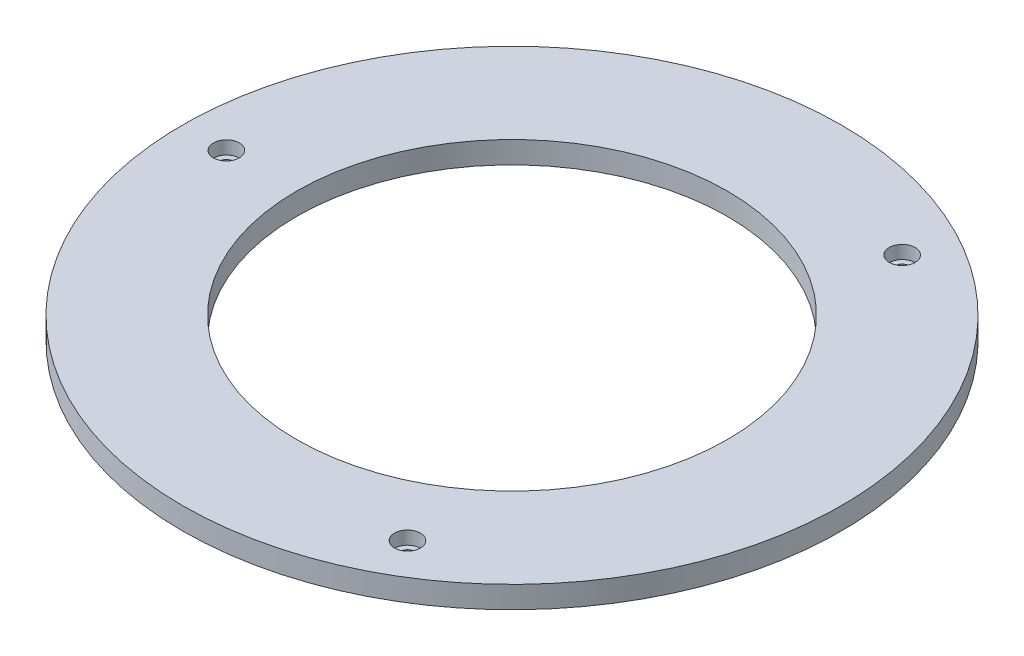
ISO-10303-21;
HEADER;
FILE_DESCRIPTION(('STEP AP214'),'2;1');
FILE_NAME('part.step','',(''),(''),'','','');
FILE_SCHEMA(('AUTOMOTIVE_DESIGN { 1 0 10303 214 1 1 1 1 }'));
ENDSEC;
DATA;
#1=APPLICATION_CONTEXT('core data for automotive mechanical design processes');
#2=APPLICATION_PROTOCOL_DEFINITION('international standard','automotive_design',2000,#1);
#3=PRODUCT_CONTEXT('',#1,'mechanical');
#4=PRODUCT('Part','Part','',(#3));
#5=PRODUCT_RELATED_PRODUCT_CATEGORY('part','',(#4));
#6=PRODUCT_DEFINITION_FORMATION('','',#4);
#7=PRODUCT_DEFINITION_CONTEXT('part definition',#1,'design');
#8=PRODUCT_DEFINITION('design','',#6,#7);
#9=PRODUCT_DEFINITION_SHAPE('','',#8);
#10=(LENGTH_UNIT() NAMED_UNIT(*) SI_UNIT(.MILLI.,.METRE.));
#11=(NAMED_UNIT(*) PLANE_ANGLE_UNIT() SI_UNIT($,.RADIAN.));
#12=(NAMED_UNIT(*) SI_UNIT($,.STERADIAN.) SOLID_ANGLE_UNIT());
#13=UNCERTAINTY_MEASURE_WITH_UNIT(LENGTH_MEASURE(1.E-05),#10,'distance_accuracy_value','');
#14=(GEOMETRIC_REPRESENTATION_CONTEXT(3) GLOBAL_UNCERTAINTY_ASSIGNED_CONTEXT((#13)) GLOBAL_UNIT_ASSIGNED_CONTEXT((#10,
#11,#12)) REPRESENTATION_CONTEXT('',''));
#15=CARTESIAN_POINT('',(0.,0.,0.));
#16=DIRECTION('',(0.,0.,1.));
#17=DIRECTION('',(1.,0.,0.));
#18=AXIS2_PLACEMENT_3D('',#15,#16,#17);
#19=CARTESIAN_POINT('',(32.4999999999996,1.27675647831893E-12,-56.2916512459888));
#20=DIRECTION('',(0.,1.,0.));
#21=DIRECTION('',(0.,0.,1.00000000000001));
#22=AXIS2_PLACEMENT_3D('',#19,#20,#21);
#23=CYLINDRICAL_SURFACE('',#22,1.7);
#24=CARTESIAN_POINT('',(32.4999999999996,1.27675647831893E-12,-56.2916512459888));
#25=DIRECTION('',(0.,1.,0.));
#26=DIRECTION('',(-0.866025403784452,0.,-0.499999999999997));
#27=AXIS2_PLACEMENT_3D('',#24,#25,#26);
#28=CIRCLE('',#27,1.7);
#29=CARTESIAN_POINT('',(31.027756813566,1.27675647831893E-12,-57.1416512459888));
#30=VERTEX_POINT('',#29);
#31=EDGE_CURVE('E75',#30,#30,#28,.T.);
#32=ORIENTED_EDGE('',*,*,#31,.F.);
#33=EDGE_LOOP('',(#32));
#34=FACE_BOUND('',#33,.T.);
#35=CARTESIAN_POINT('',(32.5,2.00000000000128,-56.2916512459886));
#36=DIRECTION('',(0.,1.,0.));
#37=DIRECTION('',(0.,0.,1.00000000000001));
#38=AXIS2_PLACEMENT_3D('',#35,#36,#37);
#39=CIRCLE('',#38,1.7);
#40=CARTESIAN_POINT('',(32.5,2.00000000000128,-54.5916512459886));
#41=VERTEX_POINT('',#40);
#42=EDGE_CURVE('E42',#41,#41,#39,.F.);
#43=ORIENTED_EDGE('',*,*,#42,.F.);
#44=EDGE_LOOP('',(#43));
#45=FACE_BOUND('',#44,.T.);
#46=ADVANCED_FACE('F38',(#34,#45),#23,.F.);
#47=CARTESIAN_POINT('',(32.5000000000009,1.27675647831893E-12,56.291651245989));
#48=DIRECTION('',(0.,1.,0.));
#49=DIRECTION('',(0.,0.,1.00000000000001));
#50=AXIS2_PLACEMENT_3D('',#47,#48,#49);
#51=CYLINDRICAL_SURFACE('',#50,1.7);
#52=CARTESIAN_POINT('',(32.5000000000009,1.27675647831893E-12,56.291651245989));
#53=DIRECTION('',(0.,1.,0.));
#54=DIRECTION('',(0.866025403784446,0.,-0.50000000000001));
#55=AXIS2_PLACEMENT_3D('',#52,#53,#54);
#56=CIRCLE('',#55,1.7);
#57=CARTESIAN_POINT('',(33.9722431864345,1.27675647831893E-12,55.4416512459889));
#58=VERTEX_POINT('',#57);
#59=EDGE_CURVE('E94',#58,#58,#56,.T.);
#60=ORIENTED_EDGE('',*,*,#59,.F.);
#61=EDGE_LOOP('',(#60));
#62=FACE_BOUND('',#61,.T.);
#63=CARTESIAN_POINT('',(32.500000000001,2.00000000000128,56.291651245989));
#64=DIRECTION('',(0.,1.,0.));
#65=DIRECTION('',(0.,0.,1.00000000000001));
#66=AXIS2_PLACEMENT_3D('',#63,#64,#65);
#67=CIRCLE('',#66,1.7);
#68=CARTESIAN_POINT('',(32.500000000001,2.00000000000128,57.991651245989));
#69=VERTEX_POINT('',#68);
#70=EDGE_CURVE('E65',#69,#69,#67,.F.);
#71=ORIENTED_EDGE('',*,*,#70,.F.);
#72=EDGE_LOOP('',(#71));
#73=FACE_BOUND('',#72,.T.);
#74=ADVANCED_FACE('F137',(#62,#73),#51,.F.);
#75=CARTESIAN_POINT('',(-65.0000000000001,1.27675647831893E-12,0.));
#76=DIRECTION('',(0.,1.,0.));
#77=DIRECTION('',(0.,0.,1.00000000000001));
#78=AXIS2_PLACEMENT_3D('',#75,#76,#77);
#79=CYLINDRICAL_SURFACE('',#78,1.7);
#80=CARTESIAN_POINT('',(-65.0000000000001,1.27675647831893E-12,0.));
#81=DIRECTION('',(0.,1.,0.));
#82=DIRECTION('',(0.,0.,1.00000000000001));
#83=AXIS2_PLACEMENT_3D('',#80,#81,#82);
#84=CIRCLE('',#83,1.7);
#85=CARTESIAN_POINT('',(-65.0000000000001,1.27675647831893E-12,1.70000000000002));
#86=VERTEX_POINT('',#85);
#87=EDGE_CURVE('E63',#86,#86,#84,.T.);
#88=ORIENTED_EDGE('',*,*,#87,.F.);
#89=EDGE_LOOP('',(#88));
#90=FACE_BOUND('',#89,.T.);
#91=CARTESIAN_POINT('',(-65.0000000000001,2.00000000000128,0.));
#92=DIRECTION('',(0.,1.,0.));
#93=DIRECTION('',(0.,0.,1.00000000000001));
#94=AXIS2_PLACEMENT_3D('',#91,#92,#93);
#95=CIRCLE('',#94,1.7);
#96=CARTESIAN_POINT('',(-65.0000000000001,2.00000000000128,1.70000000000002));
#97=VERTEX_POINT('',#96);
#98=EDGE_CURVE('E60',#97,#97,#95,.F.);
#99=ORIENTED_EDGE('',*,*,#98,.F.);
#100=EDGE_LOOP('',(#99));
#101=FACE_BOUND('',#100,.T.);
#102=ADVANCED_FACE('F143',(#90,#101),#79,.F.);
#103=CARTESIAN_POINT('',(1.66533453693773E-13,5.,5.55111512312578E-13));
#104=DIRECTION('',(0.,1.,0.));
#105=DIRECTION('',(0.,0.,1.00000000000001));
#106=AXIS2_PLACEMENT_3D('',#103,#104,#105);
#107=PLANE('',#106);
#108=CARTESIAN_POINT('',(32.500000000001,5.00000000000128,56.2916512459901));
#109=DIRECTION('',(0.,1.,0.));
#110=DIRECTION('',(0.866025403784446,0.,-0.50000000000001));
#111=AXIS2_PLACEMENT_3D('',#108,#109,#110);
#112=CIRCLE('',#111,2.95);
#113=CARTESIAN_POINT('',(35.0547749411651,5.00000000000128,54.8166512459901));
#114=VERTEX_POINT('',#113);
#115=EDGE_CURVE('E77',#114,#114,#112,.T.);
#116=ORIENTED_EDGE('',*,*,#115,.F.);
#117=EDGE_LOOP('',(#116));
#118=FACE_BOUND('',#117,.T.);
#119=CARTESIAN_POINT('',(32.4999999999996,5.00000000000128,-56.2916512459888));
#120=DIRECTION('',(0.,1.,0.));
#121=DIRECTION('',(-0.866025403784452,0.,-0.499999999999997));
#122=AXIS2_PLACEMENT_3D('',#119,#120,#121);
#123=CIRCLE('',#122,2.95);
#124=CARTESIAN_POINT('',(29.9452250588355,5.00000000000128,-57.7666512459888));
#125=VERTEX_POINT('',#124);
#126=EDGE_CURVE('E90',#125,#125,#123,.T.);
#127=ORIENTED_EDGE('',*,*,#126,.F.);
#128=EDGE_LOOP('',(#127));
#129=FACE_BOUND('',#128,.T.);
#130=CARTESIAN_POINT('',(-65.,5.00000000000128,0.));
#131=DIRECTION('',(0.,1.,0.));
#132=DIRECTION('',(0.,0.,1.00000000000001));
#133=AXIS2_PLACEMENT_3D('',#130,#131,#132);
#134=CIRCLE('',#133,2.95);
#135=CARTESIAN_POINT('',(-65.,5.00000000000128,2.95000000000003));
#136=VERTEX_POINT('',#135);
#137=EDGE_CURVE('E98',#136,#136,#134,.T.);
#138=ORIENTED_EDGE('',*,*,#137,.F.);
#139=EDGE_LOOP('',(#138));
#140=FACE_BOUND('',#139,.T.);
#141=CARTESIAN_POINT('',(1.66533453693773E-13,5.,5.55111512312578E-13));
#142=DIRECTION('',(0.,1.,0.));
#143=DIRECTION('',(0.,0.,1.00000000000001));
#144=AXIS2_PLACEMENT_3D('',#141,#142,#143);
#145=CIRCLE('',#144,75.);
#146=CARTESIAN_POINT('',(1.70696790036118E-13,5.,75.0000000000013));
#147=VERTEX_POINT('',#146);
#148=EDGE_CURVE('E10',#147,#147,#145,.T.);
#149=ORIENTED_EDGE('',*,*,#148,.T.);
#150=EDGE_LOOP('',(#149));
#151=FACE_BOUND('',#150,.T.);
#152=CARTESIAN_POINT('',(1.66533453693773E-13,5.,5.55111512312578E-13));
#153=DIRECTION('',(0.,1.,0.));
#154=DIRECTION('',(0.,0.,1.00000000000001));
#155=AXIS2_PLACEMENT_3D('',#152,#153,#154);
#156=CIRCLE('',#155,49.);
#157=CARTESIAN_POINT('',(1.69253500104105E-13,5.,49.0000000000011));
#158=VERTEX_POINT('',#157);
#159=EDGE_CURVE('E54',#158,#158,#156,.T.);
#160=ORIENTED_EDGE('',*,*,#159,.F.);
#161=EDGE_LOOP('',(#160));
#162=FACE_BOUND('',#161,.T.);
#163=ADVANCED_FACE('F154',(#118,#129,#140,#151,#162),#107,.T.);
#164=CARTESIAN_POINT('',(0.,0.,0.));
#165=DIRECTION('',(0.,1.,0.));
#166=DIRECTION('',(0.,0.,1.00000000000001));
#167=AXIS2_PLACEMENT_3D('',#164,#165,#166);
#168=PLANE('',#167);
#169=ORIENTED_EDGE('',*,*,#59,.T.);
#170=EDGE_LOOP('',(#169));
#171=FACE_BOUND('',#170,.T.);
#172=ORIENTED_EDGE('',*,*,#31,.T.);
#173=EDGE_LOOP('',(#172));
#174=FACE_BOUND('',#173,.T.);
#175=ORIENTED_EDGE('',*,*,#87,.T.);
#176=EDGE_LOOP('',(#175));
#177=FACE_BOUND('',#176,.T.);
#178=CARTESIAN_POINT('',(0.,0.,0.));
#179=DIRECTION('',(0.,1.,0.));
#180=DIRECTION('',(0.,0.,1.00000000000001));
#181=AXIS2_PLACEMENT_3D('',#178,#179,#180);
#182=CIRCLE('',#181,75.);
#183=CARTESIAN_POINT('',(0.,0.,75.0000000000008));
#184=VERTEX_POINT('',#183);
#185=EDGE_CURVE('E47',#184,#184,#182,.T.);
#186=ORIENTED_EDGE('',*,*,#185,.F.);
#187=EDGE_LOOP('',(#186));
#188=FACE_BOUND('',#187,.T.);
#189=CARTESIAN_POINT('',(0.,0.,0.));
#190=DIRECTION('',(0.,1.,0.));
#191=DIRECTION('',(0.,0.,1.00000000000001));
#192=AXIS2_PLACEMENT_3D('',#189,#190,#191);
#193=CIRCLE('',#192,49.);
#194=CARTESIAN_POINT('',(0.,0.,49.0000000000005));
#195=VERTEX_POINT('',#194);
#196=EDGE_CURVE('E57',#195,#195,#193,.T.);
#197=ORIENTED_EDGE('',*,*,#196,.T.);
#198=EDGE_LOOP('',(#197));
#199=FACE_BOUND('',#198,.T.);
#200=ADVANCED_FACE('F120',(#171,#174,#177,#188,#199),#168,.F.);
#201=CARTESIAN_POINT('',(1.66533453693773E-13,5.,5.55111512312578E-13));
#202=DIRECTION('',(0.,-1.,0.));
#203=DIRECTION('',(0.,0.,-1.00000000000001));
#204=AXIS2_PLACEMENT_3D('',#201,#202,#203);
#205=CYLINDRICAL_SURFACE('',#204,75.);
#206=ORIENTED_EDGE('',*,*,#148,.F.);
#207=EDGE_LOOP('',(#206));
#208=FACE_BOUND('',#207,.T.);
#209=ORIENTED_EDGE('',*,*,#185,.T.);
#210=EDGE_LOOP('',(#209));
#211=FACE_BOUND('',#210,.T.);
#212=ADVANCED_FACE('F40',(#208,#211),#205,.T.);
#213=CARTESIAN_POINT('',(1.66533453693773E-13,5.,5.55111512312578E-13));
#214=DIRECTION('',(0.,-1.,0.));
#215=DIRECTION('',(0.,0.,-1.00000000000001));
#216=AXIS2_PLACEMENT_3D('',#213,#214,#215);
#217=CYLINDRICAL_SURFACE('',#216,49.);
#218=ORIENTED_EDGE('',*,*,#159,.T.);
#219=EDGE_LOOP('',(#218));
#220=FACE_BOUND('',#219,.T.);
#221=ORIENTED_EDGE('',*,*,#196,.F.);
#222=EDGE_LOOP('',(#221));
#223=FACE_BOUND('',#222,.T.);
#224=ADVANCED_FACE('F122',(#220,#223),#217,.F.);
#225=CARTESIAN_POINT('',(-65.0000000000001,2.00000000000128,0.));
#226=DIRECTION('',(0.,1.,0.));
#227=DIRECTION('',(0.,0.,1.00000000000001));
#228=AXIS2_PLACEMENT_3D('',#225,#226,#227);
#229=PLANE('',#228);
#230=CARTESIAN_POINT('',(-65.0000000000001,2.00000000000128,0.));
#231=DIRECTION('',(0.,1.,0.));
#232=DIRECTION('',(0.,0.,1.00000000000001));
#233=AXIS2_PLACEMENT_3D('',#230,#231,#232);
#234=CIRCLE('',#233,2.95);
#235=CARTESIAN_POINT('',(-65.0000000000001,2.00000000000128,2.95000000000003));
#236=VERTEX_POINT('',#235);
#237=EDGE_CURVE('E64',#236,#236,#234,.T.);
#238=ORIENTED_EDGE('',*,*,#237,.T.);
#239=EDGE_LOOP('',(#238));
#240=FACE_BOUND('',#239,.T.);
#241=ORIENTED_EDGE('',*,*,#98,.T.);
#242=EDGE_LOOP('',(#241));
#243=FACE_BOUND('',#242,.T.);
#244=ADVANCED_FACE('F124',(#240,#243),#229,.T.);
#245=CARTESIAN_POINT('',(-65.0000000000001,2.00000000000128,0.));
#246=DIRECTION('',(0.,1.,0.));
#247=DIRECTION('',(0.,0.,1.00000000000001));
#248=AXIS2_PLACEMENT_3D('',#245,#246,#247);
#249=CYLINDRICAL_SURFACE('',#248,2.95);
#250=ORIENTED_EDGE('',*,*,#237,.F.);
#251=EDGE_LOOP('',(#250));
#252=FACE_BOUND('',#251,.T.);
#253=ORIENTED_EDGE('',*,*,#137,.T.);
#254=EDGE_LOOP('',(#253));
#255=FACE_BOUND('',#254,.T.);
#256=ADVANCED_FACE('F130',(#252,#255),#249,.F.);
#257=CARTESIAN_POINT('',(32.500000000001,2.00000000000128,56.291651245989));
#258=DIRECTION('',(0.,1.,0.));
#259=DIRECTION('',(0.866025403784446,0.,-0.50000000000001));
#260=AXIS2_PLACEMENT_3D('',#257,#258,#259);
#261=PLANE('',#260);
#262=CARTESIAN_POINT('',(32.500000000001,2.00000000000128,56.291651245989));
#263=DIRECTION('',(0.,1.,0.));
#264=DIRECTION('',(0.866025403784446,0.,-0.50000000000001));
#265=AXIS2_PLACEMENT_3D('',#262,#263,#264);
#266=CIRCLE('',#265,2.95);
#267=CARTESIAN_POINT('',(35.0547749411651,2.00000000000128,54.8166512459889));
#268=VERTEX_POINT('',#267);
#269=EDGE_CURVE('E68',#268,#268,#266,.T.);
#270=ORIENTED_EDGE('',*,*,#269,.T.);
#271=EDGE_LOOP('',(#270));
#272=FACE_BOUND('',#271,.T.);
#273=ORIENTED_EDGE('',*,*,#70,.T.);
#274=EDGE_LOOP('',(#273));
#275=FACE_BOUND('',#274,.T.);
#276=ADVANCED_FACE('F151',(#272,#275),#261,.T.);
#277=CARTESIAN_POINT('',(32.500000000001,2.00000000000128,56.291651245989));
#278=DIRECTION('',(0.,1.,0.));
#279=DIRECTION('',(0.,0.,1.00000000000001));
#280=AXIS2_PLACEMENT_3D('',#277,#278,#279);
#281=CYLINDRICAL_SURFACE('',#280,2.95);
#282=ORIENTED_EDGE('',*,*,#269,.F.);
#283=EDGE_LOOP('',(#282));
#284=FACE_BOUND('',#283,.T.);
#285=ORIENTED_EDGE('',*,*,#115,.T.);
#286=EDGE_LOOP('',(#285));
#287=FACE_BOUND('',#286,.T.);
#288=ADVANCED_FACE('F208',(#284,#287),#281,.F.);
#289=CARTESIAN_POINT('',(32.5,2.00000000000128,-56.2916512459886));
#290=DIRECTION('',(0.,1.,0.));
#291=DIRECTION('',(-0.866025403784452,0.,-0.499999999999997));
#292=AXIS2_PLACEMENT_3D('',#289,#290,#291);
#293=PLANE('',#292);
#294=CARTESIAN_POINT('',(32.5,2.00000000000128,-56.2916512459886));
#295=DIRECTION('',(0.,1.,0.));
#296=DIRECTION('',(-0.866025403784452,0.,-0.499999999999997));
#297=AXIS2_PLACEMENT_3D('',#294,#295,#296);
#298=CIRCLE('',#297,2.95);
#299=CARTESIAN_POINT('',(29.9452250588359,2.00000000000128,-57.7666512459886));
#300=VERTEX_POINT('',#299);
#301=EDGE_CURVE('E84',#300,#300,#298,.T.);
#302=ORIENTED_EDGE('',*,*,#301,.T.);
#303=EDGE_LOOP('',(#302));
#304=FACE_BOUND('',#303,.T.);
#305=ORIENTED_EDGE('',*,*,#42,.T.);
#306=EDGE_LOOP('',(#305));
#307=FACE_BOUND('',#306,.T.);
#308=ADVANCED_FACE('F218',(#304,#307),#293,.T.);
#309=CARTESIAN_POINT('',(32.5,2.00000000000128,-56.2916512459886));
#310=DIRECTION('',(0.,1.,0.));
#311=DIRECTION('',(0.,0.,1.00000000000001));
#312=AXIS2_PLACEMENT_3D('',#309,#310,#311);
#313=CYLINDRICAL_SURFACE('',#312,2.95);
#314=ORIENTED_EDGE('',*,*,#301,.F.);
#315=EDGE_LOOP('',(#314));
#316=FACE_BOUND('',#315,.T.);
#317=ORIENTED_EDGE('',*,*,#126,.T.);
#318=EDGE_LOOP('',(#317));
#319=FACE_BOUND('',#318,.T.);
#320=ADVANCED_FACE('F228',(#316,#319),#313,.F.);
#321=CLOSED_SHELL('',(#46,#74,#102,#163,#200,#212,#224,#244,#256,#276,#288,#308,#320));
#322=MANIFOLD_SOLID_BREP('B2',#321);
#323=ADVANCED_BREP_SHAPE_REPRESENTATION('',(#18,#322),#14);
#324=SHAPE_DEFINITION_REPRESENTATION(#9,#323);
ENDSEC;
END-ISO-10303-21;
